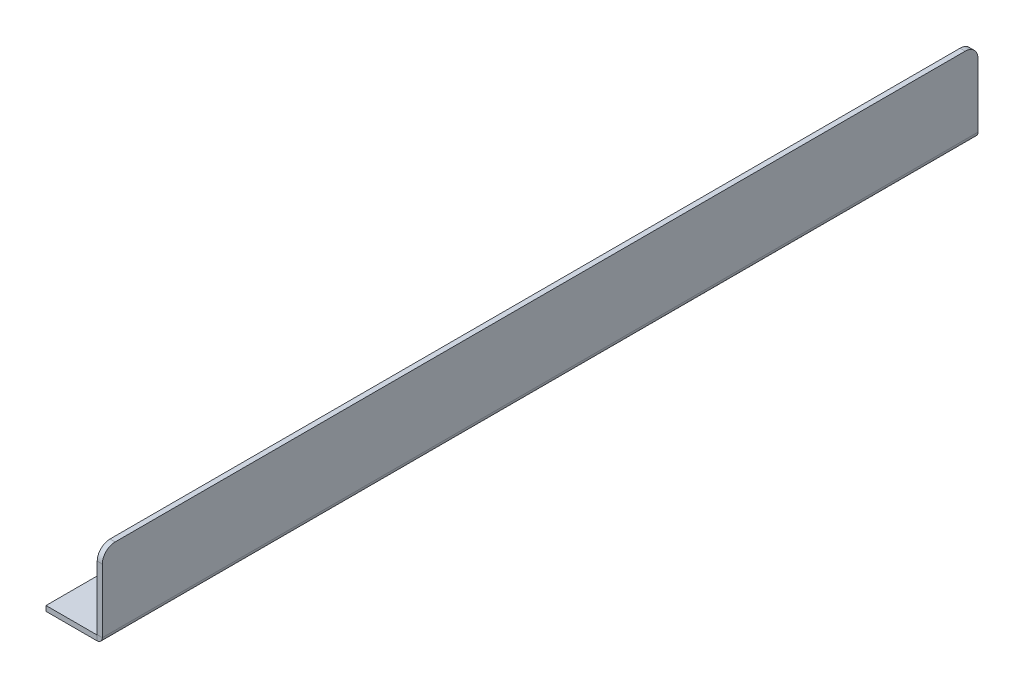
ISO-10303-21;
HEADER;
FILE_DESCRIPTION(('STEP AP214'),'2;1');
FILE_NAME('part.step','',(''),(''),'','','');
FILE_SCHEMA(('AUTOMOTIVE_DESIGN { 1 0 10303 214 1 1 1 1 }'));
ENDSEC;
DATA;
#1=APPLICATION_CONTEXT('core data for automotive mechanical design processes');
#2=APPLICATION_PROTOCOL_DEFINITION('international standard','automotive_design',2000,#1);
#3=PRODUCT_CONTEXT('',#1,'mechanical');
#4=PRODUCT('Part','Part','',(#3));
#5=PRODUCT_RELATED_PRODUCT_CATEGORY('part','',(#4));
#6=PRODUCT_DEFINITION_FORMATION('','',#4);
#7=PRODUCT_DEFINITION_CONTEXT('part definition',#1,'design');
#8=PRODUCT_DEFINITION('design','',#6,#7);
#9=PRODUCT_DEFINITION_SHAPE('','',#8);
#10=(LENGTH_UNIT() NAMED_UNIT(*) SI_UNIT(.MILLI.,.METRE.));
#11=(NAMED_UNIT(*) PLANE_ANGLE_UNIT() SI_UNIT($,.RADIAN.));
#12=(NAMED_UNIT(*) SI_UNIT($,.STERADIAN.) SOLID_ANGLE_UNIT());
#13=UNCERTAINTY_MEASURE_WITH_UNIT(LENGTH_MEASURE(1.E-05),#10,'distance_accuracy_value','');
#14=(GEOMETRIC_REPRESENTATION_CONTEXT(3) GLOBAL_UNCERTAINTY_ASSIGNED_CONTEXT((#13)) GLOBAL_UNIT_ASSIGNED_CONTEXT((#10,
#11,#12)) REPRESENTATION_CONTEXT('',''));
#15=CARTESIAN_POINT('',(0.,0.,0.));
#16=DIRECTION('',(0.,0.,1.));
#17=DIRECTION('',(1.,0.,0.));
#18=AXIS2_PLACEMENT_3D('',#15,#16,#17);
#19=CARTESIAN_POINT('',(0.,-2.,342.));
#20=DIRECTION('',(0.,1.,0.));
#21=DIRECTION('',(-1.,0.,0.));
#22=AXIS2_PLACEMENT_3D('',#19,#20,#21);
#23=PLANE('',#22);
#24=CARTESIAN_POINT('',(-11.,-2.,55.));
#25=DIRECTION('',(0.,1.,0.));
#26=DIRECTION('',(-1.,0.,0.));
#27=AXIS2_PLACEMENT_3D('',#24,#25,#26);
#28=CIRCLE('',#27,3.73499999999999);
#29=CARTESIAN_POINT('',(-14.735,-2.,55.));
#30=VERTEX_POINT('',#29);
#31=EDGE_CURVE('E232',#30,#30,#28,.T.);
#32=ORIENTED_EDGE('',*,*,#31,.T.);
#33=EDGE_LOOP('',(#32));
#34=FACE_BOUND('',#33,.T.);
#35=CARTESIAN_POINT('',(-11.,-2.,262.));
#36=DIRECTION('',(0.,1.,0.));
#37=DIRECTION('',(-1.,0.,0.));
#38=AXIS2_PLACEMENT_3D('',#35,#36,#37);
#39=CIRCLE('',#38,3.73499999999999);
#40=CARTESIAN_POINT('',(-14.735,-2.,262.));
#41=VERTEX_POINT('',#40);
#42=EDGE_CURVE('E167',#41,#41,#39,.T.);
#43=ORIENTED_EDGE('',*,*,#42,.T.);
#44=EDGE_LOOP('',(#43));
#45=FACE_BOUND('',#44,.T.);
#46=DIRECTION('',(1.,0.,0.));
#47=VECTOR('',#46,1.);
#48=CARTESIAN_POINT('',(0.,-2.,0.));
#49=LINE('',#48,#47);
#50=CARTESIAN_POINT('',(-20.,-2.,0.));
#51=VERTEX_POINT('',#50);
#52=CARTESIAN_POINT('',(-0.1,-2.,0.));
#53=VERTEX_POINT('',#52);
#54=EDGE_CURVE('E177',#51,#53,#49,.T.);
#55=ORIENTED_EDGE('',*,*,#54,.T.);
#56=DIRECTION('',(0.,0.,-1.));
#57=VECTOR('',#56,1.);
#58=CARTESIAN_POINT('',(-0.1,-2.,342.));
#59=LINE('',#58,#57);
#60=CARTESIAN_POINT('',(-0.1,-2.,342.));
#61=VERTEX_POINT('',#60);
#62=EDGE_CURVE('E185',#61,#53,#59,.T.);
#63=ORIENTED_EDGE('',*,*,#62,.F.);
#64=DIRECTION('',(1.,0.,0.));
#65=VECTOR('',#64,1.);
#66=CARTESIAN_POINT('',(0.,-2.,342.));
#67=LINE('',#66,#65);
#68=CARTESIAN_POINT('',(-20.,-2.,342.));
#69=VERTEX_POINT('',#68);
#70=EDGE_CURVE('E159',#69,#61,#67,.T.);
#71=ORIENTED_EDGE('',*,*,#70,.F.);
#72=DIRECTION('',(0.,0.,-1.));
#73=VECTOR('',#72,1.);
#74=CARTESIAN_POINT('',(-20.,-2.,342.));
#75=LINE('',#74,#73);
#76=EDGE_CURVE('E188',#69,#51,#75,.T.);
#77=ORIENTED_EDGE('',*,*,#76,.T.);
#78=EDGE_LOOP('',(#55,#63,#71,#77));
#79=FACE_BOUND('',#78,.T.);
#80=ADVANCED_FACE('F39',(#34,#45,#79),#23,.F.);
#81=CARTESIAN_POINT('',(0.,0.1,342.));
#82=DIRECTION('',(0.,0.,1.));
#83=DIRECTION('',(1.,0.,0.));
#84=AXIS2_PLACEMENT_3D('',#81,#82,#83);
#85=PLANE('',#84);
#86=DIRECTION('',(1.,0.,0.));
#87=VECTOR('',#86,1.);
#88=CARTESIAN_POINT('',(0.,0.1,342.));
#89=LINE('',#88,#87);
#90=CARTESIAN_POINT('',(0.,0.1,342.));
#91=VERTEX_POINT('',#90);
#92=CARTESIAN_POINT('',(2.,0.1,342.));
#93=VERTEX_POINT('',#92);
#94=EDGE_CURVE('E118',#91,#93,#89,.T.);
#95=ORIENTED_EDGE('',*,*,#94,.F.);
#96=CARTESIAN_POINT('',(-0.1,0.1,342.));
#97=DIRECTION('',(0.,0.,-1.));
#98=DIRECTION('',(-1.,0.,0.));
#99=AXIS2_PLACEMENT_3D('',#96,#97,#98);
#100=CIRCLE('',#99,0.1);
#101=CARTESIAN_POINT('',(-0.1,0.,342.));
#102=VERTEX_POINT('',#101);
#103=EDGE_CURVE('E122',#102,#91,#100,.F.);
#104=ORIENTED_EDGE('',*,*,#103,.F.);
#105=DIRECTION('',(0.,1.,0.));
#106=VECTOR('',#105,1.);
#107=CARTESIAN_POINT('',(-0.1,-2.,342.));
#108=LINE('',#107,#106);
#109=EDGE_CURVE('E128',#61,#102,#108,.T.);
#110=ORIENTED_EDGE('',*,*,#109,.F.);
#111=CARTESIAN_POINT('',(-0.1,0.1,342.));
#112=DIRECTION('',(0.,0.,1.));
#113=DIRECTION('',(1.,0.,0.));
#114=AXIS2_PLACEMENT_3D('',#111,#112,#113);
#115=CIRCLE('',#114,2.1);
#116=EDGE_CURVE('E125',#61,#93,#115,.T.);
#117=ORIENTED_EDGE('',*,*,#116,.T.);
#118=EDGE_LOOP('',(#95,#104,#110,#117));
#119=FACE_BOUND('',#118,.T.);
#120=ADVANCED_FACE('F120',(#119),#85,.T.);
#121=CARTESIAN_POINT('',(-0.1,-2.,342.));
#122=DIRECTION('',(0.,0.,1.));
#123=DIRECTION('',(1.,0.,0.));
#124=AXIS2_PLACEMENT_3D('',#121,#122,#123);
#125=PLANE('',#124);
#126=DIRECTION('',(0.,1.,0.));
#127=VECTOR('',#126,1.);
#128=CARTESIAN_POINT('',(2.,0.,342.));
#129=LINE('',#128,#127);
#130=CARTESIAN_POINT('',(2.,25.,342.));
#131=VERTEX_POINT('',#130);
#132=EDGE_CURVE('E146',#93,#131,#129,.T.);
#133=ORIENTED_EDGE('',*,*,#132,.T.);
#134=DIRECTION('',(1.,0.,0.));
#135=VECTOR('',#134,1.);
#136=CARTESIAN_POINT('',(-0.1,25.,342.));
#137=LINE('',#136,#135);
#138=CARTESIAN_POINT('',(0.,25.,342.));
#139=VERTEX_POINT('',#138);
#140=EDGE_CURVE('E11',#131,#139,#137,.F.);
#141=ORIENTED_EDGE('',*,*,#140,.T.);
#142=DIRECTION('',(0.,1.,0.));
#143=VECTOR('',#142,1.);
#144=CARTESIAN_POINT('',(0.,0.,342.));
#145=LINE('',#144,#143);
#146=EDGE_CURVE('E135',#91,#139,#145,.T.);
#147=ORIENTED_EDGE('',*,*,#146,.F.);
#148=ORIENTED_EDGE('',*,*,#94,.T.);
#149=EDGE_LOOP('',(#133,#141,#147,#148));
#150=FACE_BOUND('',#149,.T.);
#151=ADVANCED_FACE('F145',(#150),#125,.T.);
#152=CARTESIAN_POINT('',(-0.1,0.,0.));
#153=DIRECTION('',(0.,0.,-1.));
#154=DIRECTION('',(-1.,0.,0.));
#155=AXIS2_PLACEMENT_3D('',#152,#153,#154);
#156=PLANE('',#155);
#157=DIRECTION('',(0.,-1.,0.));
#158=VECTOR('',#157,1.);
#159=CARTESIAN_POINT('',(-0.1,0.,0.));
#160=LINE('',#159,#158);
#161=CARTESIAN_POINT('',(-0.1,0.,0.));
#162=VERTEX_POINT('',#161);
#163=EDGE_CURVE('E198',#162,#53,#160,.T.);
#164=ORIENTED_EDGE('',*,*,#163,.F.);
#165=CARTESIAN_POINT('',(-0.1,0.1,0.));
#166=DIRECTION('',(0.,0.,-1.));
#167=DIRECTION('',(-1.,0.,0.));
#168=AXIS2_PLACEMENT_3D('',#165,#166,#167);
#169=CIRCLE('',#168,0.1);
#170=CARTESIAN_POINT('',(0.,0.1,0.));
#171=VERTEX_POINT('',#170);
#172=EDGE_CURVE('E169',#162,#171,#169,.F.);
#173=ORIENTED_EDGE('',*,*,#172,.T.);
#174=DIRECTION('',(-1.,0.,0.));
#175=VECTOR('',#174,1.);
#176=CARTESIAN_POINT('',(2.,0.1,0.));
#177=LINE('',#176,#175);
#178=CARTESIAN_POINT('',(2.,0.1,0.));
#179=VERTEX_POINT('',#178);
#180=EDGE_CURVE('E196',#179,#171,#177,.T.);
#181=ORIENTED_EDGE('',*,*,#180,.F.);
#182=CARTESIAN_POINT('',(-0.1,0.1,0.));
#183=DIRECTION('',(0.,0.,1.));
#184=DIRECTION('',(1.,0.,0.));
#185=AXIS2_PLACEMENT_3D('',#182,#183,#184);
#186=CIRCLE('',#185,2.1);
#187=EDGE_CURVE('E180',#53,#179,#186,.T.);
#188=ORIENTED_EDGE('',*,*,#187,.F.);
#189=EDGE_LOOP('',(#164,#173,#181,#188));
#190=FACE_BOUND('',#189,.T.);
#191=ADVANCED_FACE('F266',(#190),#156,.T.);
#192=CARTESIAN_POINT('',(2.,0.1,0.));
#193=DIRECTION('',(0.,0.,-1.));
#194=DIRECTION('',(-1.,0.,0.));
#195=AXIS2_PLACEMENT_3D('',#192,#193,#194);
#196=PLANE('',#195);
#197=DIRECTION('',(1.,0.,0.));
#198=VECTOR('',#197,1.);
#199=CARTESIAN_POINT('',(0.,0.,0.));
#200=LINE('',#199,#198);
#201=CARTESIAN_POINT('',(-20.,0.,0.));
#202=VERTEX_POINT('',#201);
#203=EDGE_CURVE('E171',#202,#162,#200,.T.);
#204=ORIENTED_EDGE('',*,*,#203,.T.);
#205=ORIENTED_EDGE('',*,*,#163,.T.);
#206=ORIENTED_EDGE('',*,*,#54,.F.);
#207=DIRECTION('',(0.,1.,0.));
#208=VECTOR('',#207,1.);
#209=CARTESIAN_POINT('',(-20.,-2.,0.));
#210=LINE('',#209,#208);
#211=EDGE_CURVE('E174',#51,#202,#210,.T.);
#212=ORIENTED_EDGE('',*,*,#211,.T.);
#213=EDGE_LOOP('',(#204,#205,#206,#212));
#214=FACE_BOUND('',#213,.T.);
#215=ADVANCED_FACE('F254',(#214),#196,.T.);
#216=CARTESIAN_POINT('',(2.,0.,342.));
#217=DIRECTION('',(-1.,0.,0.));
#218=DIRECTION('',(0.,0.,1.));
#219=AXIS2_PLACEMENT_3D('',#216,#217,#218);
#220=PLANE('',#219);
#221=DIRECTION('',(0.,1.,0.));
#222=VECTOR('',#221,1.);
#223=CARTESIAN_POINT('',(2.,0.,0.));
#224=LINE('',#223,#222);
#225=CARTESIAN_POINT('',(2.,25.,0.));
#226=VERTEX_POINT('',#225);
#227=EDGE_CURVE('E164',#179,#226,#224,.T.);
#228=ORIENTED_EDGE('',*,*,#227,.T.);
#229=CARTESIAN_POINT('',(2.,25.,5.));
#230=DIRECTION('',(-1.,0.,0.));
#231=DIRECTION('',(0.,0.,1.));
#232=AXIS2_PLACEMENT_3D('',#229,#230,#231);
#233=CIRCLE('',#232,5.);
#234=CARTESIAN_POINT('',(2.,30.,5.));
#235=VERTEX_POINT('',#234);
#236=EDGE_CURVE('E205',#226,#235,#233,.F.);
#237=ORIENTED_EDGE('',*,*,#236,.T.);
#238=DIRECTION('',(0.,0.,-1.));
#239=VECTOR('',#238,1.);
#240=CARTESIAN_POINT('',(2.,30.,342.));
#241=LINE('',#240,#239);
#242=CARTESIAN_POINT('',(2.,30.,337.));
#243=VERTEX_POINT('',#242);
#244=EDGE_CURVE('E194',#243,#235,#241,.T.);
#245=ORIENTED_EDGE('',*,*,#244,.F.);
#246=CARTESIAN_POINT('',(2.,25.,337.));
#247=DIRECTION('',(-1.,0.,0.));
#248=DIRECTION('',(0.,0.,1.));
#249=AXIS2_PLACEMENT_3D('',#246,#247,#248);
#250=CIRCLE('',#249,5.);
#251=EDGE_CURVE('E203',#243,#131,#250,.F.);
#252=ORIENTED_EDGE('',*,*,#251,.T.);
#253=ORIENTED_EDGE('',*,*,#132,.F.);
#254=DIRECTION('',(0.,0.,-1.));
#255=VECTOR('',#254,1.);
#256=CARTESIAN_POINT('',(2.,0.1,342.));
#257=LINE('',#256,#255);
#258=EDGE_CURVE('E163',#93,#179,#257,.T.);
#259=ORIENTED_EDGE('',*,*,#258,.T.);
#260=EDGE_LOOP('',(#228,#237,#245,#252,#253,#259));
#261=FACE_BOUND('',#260,.T.);
#262=ADVANCED_FACE('F221',(#261),#220,.F.);
#263=CARTESIAN_POINT('',(0.,30.,342.));
#264=DIRECTION('',(0.,1.,0.));
#265=DIRECTION('',(0.,0.,1.));
#266=AXIS2_PLACEMENT_3D('',#263,#264,#265);
#267=PLANE('',#266);
#268=ORIENTED_EDGE('',*,*,#244,.T.);
#269=DIRECTION('',(1.,0.,0.));
#270=VECTOR('',#269,1.);
#271=CARTESIAN_POINT('',(0.,30.,5.));
#272=LINE('',#271,#270);
#273=CARTESIAN_POINT('',(0.,30.,5.));
#274=VERTEX_POINT('',#273);
#275=EDGE_CURVE('E60',#235,#274,#272,.F.);
#276=ORIENTED_EDGE('',*,*,#275,.T.);
#277=DIRECTION('',(0.,0.,-1.));
#278=VECTOR('',#277,1.);
#279=CARTESIAN_POINT('',(0.,30.,342.));
#280=LINE('',#279,#278);
#281=CARTESIAN_POINT('',(0.,30.,337.));
#282=VERTEX_POINT('',#281);
#283=EDGE_CURVE('E142',#282,#274,#280,.T.);
#284=ORIENTED_EDGE('',*,*,#283,.F.);
#285=DIRECTION('',(1.,0.,0.));
#286=VECTOR('',#285,1.);
#287=CARTESIAN_POINT('',(0.,30.,337.));
#288=LINE('',#287,#286);
#289=EDGE_CURVE('E207',#282,#243,#288,.T.);
#290=ORIENTED_EDGE('',*,*,#289,.T.);
#291=EDGE_LOOP('',(#268,#276,#284,#290));
#292=FACE_BOUND('',#291,.T.);
#293=ADVANCED_FACE('F222',(#292),#267,.T.);
#294=CARTESIAN_POINT('',(0.,0.,342.));
#295=DIRECTION('',(-1.,0.,0.));
#296=DIRECTION('',(0.,0.,1.));
#297=AXIS2_PLACEMENT_3D('',#294,#295,#296);
#298=PLANE('',#297);
#299=ORIENTED_EDGE('',*,*,#283,.T.);
#300=CARTESIAN_POINT('',(0.,25.,5.));
#301=DIRECTION('',(-1.,0.,0.));
#302=DIRECTION('',(0.,0.,1.));
#303=AXIS2_PLACEMENT_3D('',#300,#301,#302);
#304=CIRCLE('',#303,5.);
#305=CARTESIAN_POINT('',(0.,25.,0.));
#306=VERTEX_POINT('',#305);
#307=EDGE_CURVE('E47',#274,#306,#304,.T.);
#308=ORIENTED_EDGE('',*,*,#307,.T.);
#309=DIRECTION('',(0.,1.,0.));
#310=VECTOR('',#309,1.);
#311=CARTESIAN_POINT('',(0.,0.,0.));
#312=LINE('',#311,#310);
#313=EDGE_CURVE('E138',#171,#306,#312,.T.);
#314=ORIENTED_EDGE('',*,*,#313,.F.);
#315=DIRECTION('',(0.,0.,-1.));
#316=VECTOR('',#315,1.);
#317=CARTESIAN_POINT('',(0.,0.1,342.));
#318=LINE('',#317,#316);
#319=EDGE_CURVE('E133',#91,#171,#318,.T.);
#320=ORIENTED_EDGE('',*,*,#319,.F.);
#321=ORIENTED_EDGE('',*,*,#146,.T.);
#322=CARTESIAN_POINT('',(0.,25.,337.));
#323=DIRECTION('',(-1.,0.,0.));
#324=DIRECTION('',(0.,0.,1.));
#325=AXIS2_PLACEMENT_3D('',#322,#323,#324);
#326=CIRCLE('',#325,5.);
#327=EDGE_CURVE('E211',#139,#282,#326,.T.);
#328=ORIENTED_EDGE('',*,*,#327,.T.);
#329=EDGE_LOOP('',(#299,#308,#314,#320,#321,#328));
#330=FACE_BOUND('',#329,.T.);
#331=ADVANCED_FACE('F134',(#330),#298,.T.);
#332=CARTESIAN_POINT('',(-0.1,0.1,342.));
#333=DIRECTION('',(0.,0.,-1.));
#334=DIRECTION('',(-1.,0.,0.));
#335=AXIS2_PLACEMENT_3D('',#332,#333,#334);
#336=CYLINDRICAL_SURFACE('',#335,0.1);
#337=ORIENTED_EDGE('',*,*,#172,.F.);
#338=DIRECTION('',(0.,0.,-1.));
#339=VECTOR('',#338,1.);
#340=CARTESIAN_POINT('',(-0.1,0.,342.));
#341=LINE('',#340,#339);
#342=EDGE_CURVE('E143',#102,#162,#341,.T.);
#343=ORIENTED_EDGE('',*,*,#342,.F.);
#344=ORIENTED_EDGE('',*,*,#103,.T.);
#345=ORIENTED_EDGE('',*,*,#319,.T.);
#346=EDGE_LOOP('',(#337,#343,#344,#345));
#347=FACE_BOUND('',#346,.T.);
#348=ADVANCED_FACE('F149',(#347),#336,.F.);
#349=CARTESIAN_POINT('',(0.,0.,342.));
#350=DIRECTION('',(0.,1.,0.));
#351=DIRECTION('',(-1.,0.,0.));
#352=AXIS2_PLACEMENT_3D('',#349,#350,#351);
#353=PLANE('',#352);
#354=CARTESIAN_POINT('',(-11.,0.,55.));
#355=DIRECTION('',(0.,1.,0.));
#356=DIRECTION('',(0.,0.,1.));
#357=AXIS2_PLACEMENT_3D('',#354,#355,#356);
#358=CIRCLE('',#357,5.735);
#359=CARTESIAN_POINT('',(-11.,0.,60.7350000000001));
#360=VERTEX_POINT('',#359);
#361=EDGE_CURVE('E235',#360,#360,#358,.T.);
#362=ORIENTED_EDGE('',*,*,#361,.F.);
#363=EDGE_LOOP('',(#362));
#364=FACE_BOUND('',#363,.T.);
#365=CARTESIAN_POINT('',(-11.,0.,262.));
#366=DIRECTION('',(0.,1.,0.));
#367=DIRECTION('',(0.,0.,1.));
#368=AXIS2_PLACEMENT_3D('',#365,#366,#367);
#369=CIRCLE('',#368,5.735);
#370=CARTESIAN_POINT('',(-11.,0.,267.735));
#371=VERTEX_POINT('',#370);
#372=EDGE_CURVE('E229',#371,#371,#369,.T.);
#373=ORIENTED_EDGE('',*,*,#372,.F.);
#374=EDGE_LOOP('',(#373));
#375=FACE_BOUND('',#374,.T.);
#376=ORIENTED_EDGE('',*,*,#203,.F.);
#377=DIRECTION('',(0.,0.,-1.));
#378=VECTOR('',#377,1.);
#379=CARTESIAN_POINT('',(-20.,0.,342.));
#380=LINE('',#379,#378);
#381=CARTESIAN_POINT('',(-20.,0.,342.));
#382=VERTEX_POINT('',#381);
#383=EDGE_CURVE('E190',#382,#202,#380,.T.);
#384=ORIENTED_EDGE('',*,*,#383,.F.);
#385=DIRECTION('',(1.,0.,0.));
#386=VECTOR('',#385,1.);
#387=CARTESIAN_POINT('',(0.,0.,342.));
#388=LINE('',#387,#386);
#389=EDGE_CURVE('E151',#382,#102,#388,.T.);
#390=ORIENTED_EDGE('',*,*,#389,.T.);
#391=ORIENTED_EDGE('',*,*,#342,.T.);
#392=EDGE_LOOP('',(#376,#384,#390,#391));
#393=FACE_BOUND('',#392,.T.);
#394=ADVANCED_FACE('F242',(#364,#375,#393),#353,.T.);
#395=CARTESIAN_POINT('',(-20.,-2.,342.));
#396=DIRECTION('',(-1.,0.,0.));
#397=DIRECTION('',(0.,0.,1.));
#398=AXIS2_PLACEMENT_3D('',#395,#396,#397);
#399=PLANE('',#398);
#400=ORIENTED_EDGE('',*,*,#211,.F.);
#401=ORIENTED_EDGE('',*,*,#76,.F.);
#402=DIRECTION('',(0.,1.,0.));
#403=VECTOR('',#402,1.);
#404=CARTESIAN_POINT('',(-20.,-2.,342.));
#405=LINE('',#404,#403);
#406=EDGE_CURVE('E153',#69,#382,#405,.T.);
#407=ORIENTED_EDGE('',*,*,#406,.T.);
#408=ORIENTED_EDGE('',*,*,#383,.T.);
#409=EDGE_LOOP('',(#400,#401,#407,#408));
#410=FACE_BOUND('',#409,.T.);
#411=ADVANCED_FACE('F245',(#410),#399,.T.);
#412=CARTESIAN_POINT('',(-0.1,0.1,342.));
#413=DIRECTION('',(0.,0.,-1.));
#414=DIRECTION('',(-1.,0.,0.));
#415=AXIS2_PLACEMENT_3D('',#412,#413,#414);
#416=CYLINDRICAL_SURFACE('',#415,2.1);
#417=ORIENTED_EDGE('',*,*,#187,.T.);
#418=ORIENTED_EDGE('',*,*,#258,.F.);
#419=ORIENTED_EDGE('',*,*,#116,.F.);
#420=ORIENTED_EDGE('',*,*,#62,.T.);
#421=EDGE_LOOP('',(#417,#418,#419,#420));
#422=FACE_BOUND('',#421,.T.);
#423=ADVANCED_FACE('F264',(#422),#416,.T.);
#424=CARTESIAN_POINT('',(-0.1,0.1,342.));
#425=DIRECTION('',(0.,0.,-1.));
#426=DIRECTION('',(-1.,0.,0.));
#427=AXIS2_PLACEMENT_3D('',#424,#425,#426);
#428=PLANE('',#427);
#429=ORIENTED_EDGE('',*,*,#70,.T.);
#430=ORIENTED_EDGE('',*,*,#109,.T.);
#431=ORIENTED_EDGE('',*,*,#389,.F.);
#432=ORIENTED_EDGE('',*,*,#406,.F.);
#433=EDGE_LOOP('',(#429,#430,#431,#432));
#434=FACE_BOUND('',#433,.T.);
#435=ADVANCED_FACE('F259',(#434),#428,.F.);
#436=CARTESIAN_POINT('',(-0.1,0.1,0.));
#437=DIRECTION('',(0.,0.,-1.));
#438=DIRECTION('',(-1.,0.,0.));
#439=AXIS2_PLACEMENT_3D('',#436,#437,#438);
#440=PLANE('',#439);
#441=ORIENTED_EDGE('',*,*,#313,.T.);
#442=DIRECTION('',(1.,0.,0.));
#443=VECTOR('',#442,1.);
#444=CARTESIAN_POINT('',(-0.1,25.,0.));
#445=LINE('',#444,#443);
#446=EDGE_CURVE('E127',#306,#226,#445,.T.);
#447=ORIENTED_EDGE('',*,*,#446,.T.);
#448=ORIENTED_EDGE('',*,*,#227,.F.);
#449=ORIENTED_EDGE('',*,*,#180,.T.);
#450=EDGE_LOOP('',(#441,#447,#448,#449));
#451=FACE_BOUND('',#450,.T.);
#452=ADVANCED_FACE('F216',(#451),#440,.T.);
#453=CARTESIAN_POINT('',(-0.1,25.,5.));
#454=DIRECTION('',(1.,0.,0.));
#455=DIRECTION('',(0.,0.,-1.));
#456=AXIS2_PLACEMENT_3D('',#453,#454,#455);
#457=CYLINDRICAL_SURFACE('',#456,5.);
#458=ORIENTED_EDGE('',*,*,#307,.F.);
#459=ORIENTED_EDGE('',*,*,#275,.F.);
#460=ORIENTED_EDGE('',*,*,#236,.F.);
#461=ORIENTED_EDGE('',*,*,#446,.F.);
#462=EDGE_LOOP('',(#458,#459,#460,#461));
#463=FACE_BOUND('',#462,.T.);
#464=ADVANCED_FACE('F218',(#463),#457,.T.);
#465=CARTESIAN_POINT('',(0.,25.,337.));
#466=DIRECTION('',(1.,0.,0.));
#467=DIRECTION('',(0.,0.,-1.));
#468=AXIS2_PLACEMENT_3D('',#465,#466,#467);
#469=CYLINDRICAL_SURFACE('',#468,5.);
#470=ORIENTED_EDGE('',*,*,#327,.F.);
#471=ORIENTED_EDGE('',*,*,#140,.F.);
#472=ORIENTED_EDGE('',*,*,#251,.F.);
#473=ORIENTED_EDGE('',*,*,#289,.F.);
#474=EDGE_LOOP('',(#470,#471,#472,#473));
#475=FACE_BOUND('',#474,.T.);
#476=ADVANCED_FACE('F41',(#475),#469,.T.);
#477=CARTESIAN_POINT('',(-11.,0.,262.));
#478=DIRECTION('',(0.,1.,0.));
#479=DIRECTION('',(0.,0.,1.));
#480=AXIS2_PLACEMENT_3D('',#477,#478,#479);
#481=CONICAL_SURFACE('',#480,5.735,0.78539816339745);
#482=ORIENTED_EDGE('',*,*,#372,.T.);
#483=EDGE_LOOP('',(#482));
#484=FACE_BOUND('',#483,.T.);
#485=ORIENTED_EDGE('',*,*,#42,.F.);
#486=EDGE_LOOP('',(#485));
#487=FACE_BOUND('',#486,.T.);
#488=ADVANCED_FACE('F348',(#484,#487),#481,.F.);
#489=CARTESIAN_POINT('',(-11.,0.,55.));
#490=DIRECTION('',(0.,1.,0.));
#491=DIRECTION('',(0.,0.,1.));
#492=AXIS2_PLACEMENT_3D('',#489,#490,#491);
#493=CONICAL_SURFACE('',#492,5.735,0.78539816339745);
#494=ORIENTED_EDGE('',*,*,#361,.T.);
#495=EDGE_LOOP('',(#494));
#496=FACE_BOUND('',#495,.T.);
#497=ORIENTED_EDGE('',*,*,#31,.F.);
#498=EDGE_LOOP('',(#497));
#499=FACE_BOUND('',#498,.T.);
#500=ADVANCED_FACE('F239',(#496,#499),#493,.F.);
#501=CLOSED_SHELL('',(#80,#120,#151,#191,#215,#262,#293,#331,#348,#394,#411,#423,#435,#452,#464,
#476,#488,#500));
#502=MANIFOLD_SOLID_BREP('B2',#501);
#503=ADVANCED_BREP_SHAPE_REPRESENTATION('',(#18,#502),#14);
#504=SHAPE_DEFINITION_REPRESENTATION(#9,#503);
ENDSEC;
END-ISO-10303-21;
